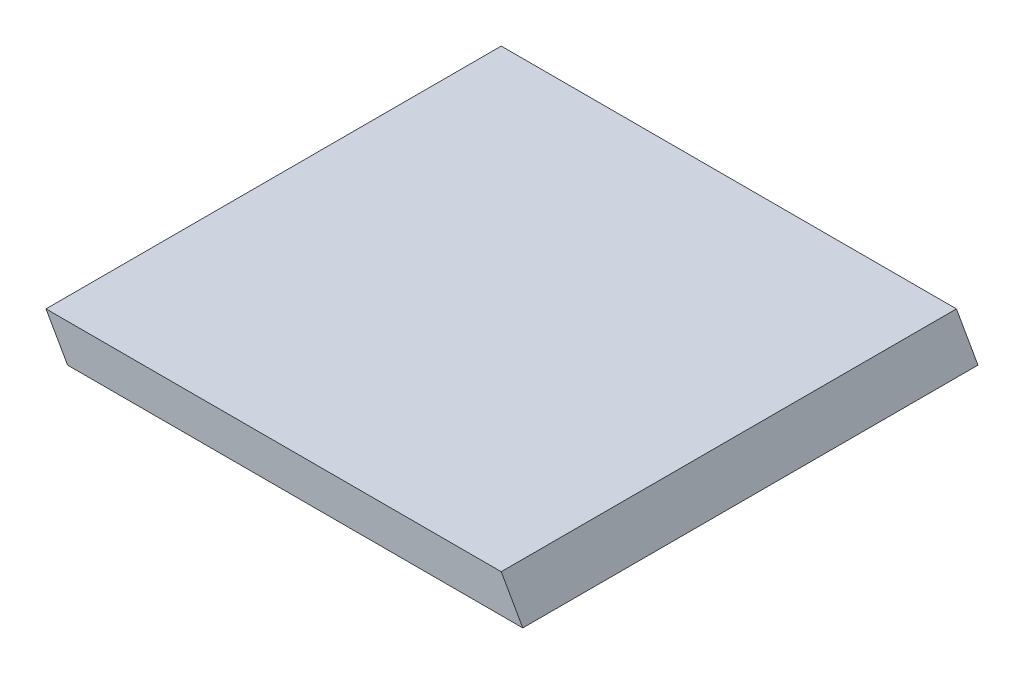
ISO-10303-21;
HEADER;
FILE_DESCRIPTION(('STEP AP214'),'2;1');
FILE_NAME('part.step','',(''),(''),'','','');
FILE_SCHEMA(('AUTOMOTIVE_DESIGN { 1 0 10303 214 1 1 1 1 }'));
ENDSEC;
DATA;
#1=APPLICATION_CONTEXT('core data for automotive mechanical design processes');
#2=APPLICATION_PROTOCOL_DEFINITION('international standard','automotive_design',2000,#1);
#3=PRODUCT_CONTEXT('',#1,'mechanical');
#4=PRODUCT('Part','Part','',(#3));
#5=PRODUCT_RELATED_PRODUCT_CATEGORY('part','',(#4));
#6=PRODUCT_DEFINITION_FORMATION('','',#4);
#7=PRODUCT_DEFINITION_CONTEXT('part definition',#1,'design');
#8=PRODUCT_DEFINITION('design','',#6,#7);
#9=PRODUCT_DEFINITION_SHAPE('','',#8);
#10=(LENGTH_UNIT() NAMED_UNIT(*) SI_UNIT(.MILLI.,.METRE.));
#11=(NAMED_UNIT(*) PLANE_ANGLE_UNIT() SI_UNIT($,.RADIAN.));
#12=(NAMED_UNIT(*) SI_UNIT($,.STERADIAN.) SOLID_ANGLE_UNIT());
#13=UNCERTAINTY_MEASURE_WITH_UNIT(LENGTH_MEASURE(1.E-05),#10,'distance_accuracy_value','');
#14=(GEOMETRIC_REPRESENTATION_CONTEXT(3) GLOBAL_UNCERTAINTY_ASSIGNED_CONTEXT((#13)) GLOBAL_UNIT_ASSIGNED_CONTEXT((#10,
#11,#12)) REPRESENTATION_CONTEXT('',''));
#15=CARTESIAN_POINT('',(0.,0.,0.));
#16=DIRECTION('',(0.,0.,1.));
#17=DIRECTION('',(1.,0.,0.));
#18=AXIS2_PLACEMENT_3D('',#15,#16,#17);
#19=CARTESIAN_POINT('',(0.,0.,0.));
#20=DIRECTION('',(0.,-1.,0.));
#21=DIRECTION('',(0.,0.,-1.));
#22=AXIS2_PLACEMENT_3D('',#19,#20,#21);
#23=PLANE('',#22);
#24=DIRECTION('',(0.,0.,-1.));
#25=VECTOR('',#24,1.);
#26=CARTESIAN_POINT('',(3.81,0.,3.81));
#27=LINE('',#26,#25);
#28=CARTESIAN_POINT('',(3.81,0.,3.81));
#29=VERTEX_POINT('',#28);
#30=CARTESIAN_POINT('',(3.81,0.,-3.81));
#31=VERTEX_POINT('',#30);
#32=EDGE_CURVE('E119',#29,#31,#27,.T.);
#33=ORIENTED_EDGE('',*,*,#32,.F.);
#34=DIRECTION('',(1.,0.,0.));
#35=VECTOR('',#34,1.);
#36=CARTESIAN_POINT('',(-3.81,0.,3.81));
#37=LINE('',#36,#35);
#38=CARTESIAN_POINT('',(-3.81,0.,3.81));
#39=VERTEX_POINT('',#38);
#40=EDGE_CURVE('E12',#39,#29,#37,.T.);
#41=ORIENTED_EDGE('',*,*,#40,.F.);
#42=DIRECTION('',(0.,0.,1.));
#43=VECTOR('',#42,1.);
#44=CARTESIAN_POINT('',(-3.81,0.,3.81));
#45=LINE('',#44,#43);
#46=CARTESIAN_POINT('',(-3.81,0.,-3.81));
#47=VERTEX_POINT('',#46);
#48=EDGE_CURVE('E53',#47,#39,#45,.T.);
#49=ORIENTED_EDGE('',*,*,#48,.F.);
#50=DIRECTION('',(-1.,0.,0.));
#51=VECTOR('',#50,1.);
#52=CARTESIAN_POINT('',(-3.81,0.,-3.81));
#53=LINE('',#52,#51);
#54=EDGE_CURVE('E155',#31,#47,#53,.T.);
#55=ORIENTED_EDGE('',*,*,#54,.F.);
#56=EDGE_LOOP('',(#33,#41,#49,#55));
#57=FACE_BOUND('',#56,.T.);
#58=ADVANCED_FACE('F43',(#57),#23,.T.);
#59=CARTESIAN_POINT('',(0.,0.635,0.));
#60=DIRECTION('',(0.,1.,0.));
#61=DIRECTION('',(0.,0.,1.));
#62=AXIS2_PLACEMENT_3D('',#59,#60,#61);
#63=PLANE('',#62);
#64=DIRECTION('',(0.,0.,-1.));
#65=VECTOR('',#64,1.);
#66=CARTESIAN_POINT('',(3.44895549457626,0.635,-3.81));
#67=LINE('',#66,#65);
#68=CARTESIAN_POINT('',(3.44895549457627,0.635,3.81));
#69=VERTEX_POINT('',#68);
#70=CARTESIAN_POINT('',(3.44895549457626,0.635,-3.81));
#71=VERTEX_POINT('',#70);
#72=EDGE_CURVE('E110',#69,#71,#67,.T.);
#73=ORIENTED_EDGE('',*,*,#72,.T.);
#74=DIRECTION('',(-1.,0.,0.));
#75=VECTOR('',#74,1.);
#76=CARTESIAN_POINT('',(-4.17104450542374,0.635,-3.81));
#77=LINE('',#76,#75);
#78=CARTESIAN_POINT('',(-4.17104450542374,0.635,-3.81));
#79=VERTEX_POINT('',#78);
#80=EDGE_CURVE('E95',#71,#79,#77,.T.);
#81=ORIENTED_EDGE('',*,*,#80,.T.);
#82=DIRECTION('',(0.,0.,1.));
#83=VECTOR('',#82,1.);
#84=CARTESIAN_POINT('',(-4.17104450542374,0.635,-3.81));
#85=LINE('',#84,#83);
#86=CARTESIAN_POINT('',(-4.17104450542373,0.635,3.81));
#87=VERTEX_POINT('',#86);
#88=EDGE_CURVE('E87',#79,#87,#85,.T.);
#89=ORIENTED_EDGE('',*,*,#88,.T.);
#90=DIRECTION('',(1.,0.,0.));
#91=VECTOR('',#90,1.);
#92=CARTESIAN_POINT('',(-4.17104450542373,0.635,3.81));
#93=LINE('',#92,#91);
#94=EDGE_CURVE('E92',#87,#69,#93,.T.);
#95=ORIENTED_EDGE('',*,*,#94,.T.);
#96=EDGE_LOOP('',(#73,#81,#89,#95));
#97=FACE_BOUND('',#96,.T.);
#98=ADVANCED_FACE('F91',(#97),#63,.T.);
#99=CARTESIAN_POINT('',(2.87921702469594,1.63704801053377,0.));
#100=DIRECTION('',(0.869310074991585,0.49426712769324,0.));
#101=DIRECTION('',(-0.49426712769324,0.869310074991585,0.));
#102=AXIS2_PLACEMENT_3D('',#99,#100,#101);
#103=PLANE('',#102);
#104=DIRECTION('',(0.49426712769324,-0.869310074991585,0.));
#105=VECTOR('',#104,1.);
#106=CARTESIAN_POINT('',(3.44895549457627,0.635,3.81));
#107=LINE('',#106,#105);
#108=EDGE_CURVE('E61',#69,#29,#107,.T.);
#109=ORIENTED_EDGE('',*,*,#108,.T.);
#110=ORIENTED_EDGE('',*,*,#32,.T.);
#111=DIRECTION('',(0.494267127693241,-0.869310074991584,0.));
#112=VECTOR('',#111,1.);
#113=CARTESIAN_POINT('',(3.44895549457626,0.635,-3.81));
#114=LINE('',#113,#112);
#115=EDGE_CURVE('E117',#71,#31,#114,.T.);
#116=ORIENTED_EDGE('',*,*,#115,.F.);
#117=ORIENTED_EDGE('',*,*,#72,.F.);
#118=EDGE_LOOP('',(#109,#110,#116,#117));
#119=FACE_BOUND('',#118,.T.);
#120=ADVANCED_FACE('F169',(#119),#103,.T.);
#121=CARTESIAN_POINT('',(0.,0.,-3.81));
#122=DIRECTION('',(0.,0.,-1.));
#123=DIRECTION('',(-1.,0.,0.));
#124=AXIS2_PLACEMENT_3D('',#121,#122,#123);
#125=PLANE('',#124);
#126=ORIENTED_EDGE('',*,*,#115,.T.);
#127=ORIENTED_EDGE('',*,*,#54,.T.);
#128=DIRECTION('',(0.494267127693241,-0.869310074991584,0.));
#129=VECTOR('',#128,1.);
#130=CARTESIAN_POINT('',(-4.17104450542374,0.635,-3.81));
#131=LINE('',#130,#129);
#132=EDGE_CURVE('E116',#79,#47,#131,.T.);
#133=ORIENTED_EDGE('',*,*,#132,.F.);
#134=ORIENTED_EDGE('',*,*,#80,.F.);
#135=EDGE_LOOP('',(#126,#127,#133,#134));
#136=FACE_BOUND('',#135,.T.);
#137=ADVANCED_FACE('F160',(#136),#125,.T.);
#138=CARTESIAN_POINT('',(0.,0.,3.81));
#139=DIRECTION('',(0.,0.,1.));
#140=DIRECTION('',(1.,0.,0.));
#141=AXIS2_PLACEMENT_3D('',#138,#139,#140);
#142=PLANE('',#141);
#143=DIRECTION('',(0.494267127693239,-0.869310074991585,0.));
#144=VECTOR('',#143,1.);
#145=CARTESIAN_POINT('',(-4.17104450542373,0.635,3.81));
#146=LINE('',#145,#144);
#147=EDGE_CURVE('E109',#87,#39,#146,.T.);
#148=ORIENTED_EDGE('',*,*,#147,.T.);
#149=ORIENTED_EDGE('',*,*,#40,.T.);
#150=ORIENTED_EDGE('',*,*,#108,.F.);
#151=ORIENTED_EDGE('',*,*,#94,.F.);
#152=EDGE_LOOP('',(#148,#149,#150,#151));
#153=FACE_BOUND('',#152,.T.);
#154=ADVANCED_FACE('F108',(#153),#142,.T.);
#155=CARTESIAN_POINT('',(-2.87921702469594,-1.63704801053378,0.));
#156=DIRECTION('',(-0.869310074991584,-0.494267127693241,0.));
#157=DIRECTION('',(0.494267127693241,-0.869310074991584,0.));
#158=AXIS2_PLACEMENT_3D('',#155,#156,#157);
#159=PLANE('',#158);
#160=ORIENTED_EDGE('',*,*,#132,.T.);
#161=ORIENTED_EDGE('',*,*,#48,.T.);
#162=ORIENTED_EDGE('',*,*,#147,.F.);
#163=ORIENTED_EDGE('',*,*,#88,.F.);
#164=EDGE_LOOP('',(#160,#161,#162,#163));
#165=FACE_BOUND('',#164,.T.);
#166=ADVANCED_FACE('F114',(#165),#159,.T.);
#167=CLOSED_SHELL('',(#58,#98,#120,#137,#154,#166));
#168=MANIFOLD_SOLID_BREP('B2',#167);
#169=ADVANCED_BREP_SHAPE_REPRESENTATION('',(#18,#168),#14);
#170=SHAPE_DEFINITION_REPRESENTATION(#9,#169);
ENDSEC;
END-ISO-10303-21;
